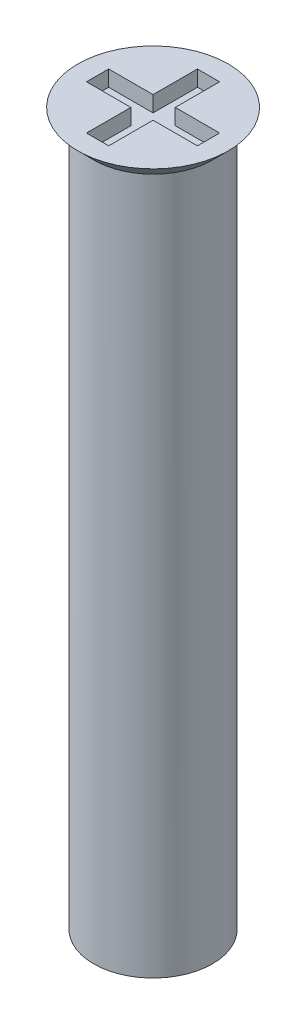
ISO-10303-21;
HEADER;
FILE_DESCRIPTION(('STEP AP214'),'2;1');
FILE_NAME('part.step','',(''),(''),'','','');
FILE_SCHEMA(('AUTOMOTIVE_DESIGN { 1 0 10303 214 1 1 1 1 }'));
ENDSEC;
DATA;
#1=APPLICATION_CONTEXT('core data for automotive mechanical design processes');
#2=APPLICATION_PROTOCOL_DEFINITION('international standard','automotive_design',2000,#1);
#3=PRODUCT_CONTEXT('',#1,'mechanical');
#4=PRODUCT('Part','Part','',(#3));
#5=PRODUCT_RELATED_PRODUCT_CATEGORY('part','',(#4));
#6=PRODUCT_DEFINITION_FORMATION('','',#4);
#7=PRODUCT_DEFINITION_CONTEXT('part definition',#1,'design');
#8=PRODUCT_DEFINITION('design','',#6,#7);
#9=PRODUCT_DEFINITION_SHAPE('','',#8);
#10=(LENGTH_UNIT() NAMED_UNIT(*) SI_UNIT(.MILLI.,.METRE.));
#11=(NAMED_UNIT(*) PLANE_ANGLE_UNIT() SI_UNIT($,.RADIAN.));
#12=(NAMED_UNIT(*) SI_UNIT($,.STERADIAN.) SOLID_ANGLE_UNIT());
#13=UNCERTAINTY_MEASURE_WITH_UNIT(LENGTH_MEASURE(1.E-05),#10,'distance_accuracy_value','');
#14=(GEOMETRIC_REPRESENTATION_CONTEXT(3) GLOBAL_UNCERTAINTY_ASSIGNED_CONTEXT((#13)) GLOBAL_UNIT_ASSIGNED_CONTEXT((#10,
#11,#12)) REPRESENTATION_CONTEXT('',''));
#15=CARTESIAN_POINT('',(0.,0.,0.));
#16=DIRECTION('',(0.,0.,1.));
#17=DIRECTION('',(1.,0.,0.));
#18=AXIS2_PLACEMENT_3D('',#15,#16,#17);
#19=CARTESIAN_POINT('',(0.,0.,0.));
#20=DIRECTION('',(0.,1.,0.));
#21=DIRECTION('',(0.,0.,1.));
#22=AXIS2_PLACEMENT_3D('',#19,#20,#21);
#23=CONICAL_SURFACE('',#22,0.,1.17196166734255);
#24=CARTESIAN_POINT('',(0.,0.31606518346736,0.));
#25=DIRECTION('',(0.,-1.,0.));
#26=DIRECTION('',(0.,0.,-1.));
#27=AXIS2_PLACEMENT_3D('',#24,#25,#26);
#28=CIRCLE('',#27,0.750000000000001);
#29=CARTESIAN_POINT('',(0.,0.31606518346736,-0.750000000000001));
#30=VERTEX_POINT('',#29);
#31=EDGE_CURVE('E207',#30,#30,#28,.T.);
#32=ORIENTED_EDGE('',*,*,#31,.T.);
#33=EDGE_LOOP('',(#32));
#34=FACE_BOUND('',#33,.T.);
#35=CARTESIAN_POINT('',(0.,0.,0.));
#36=VERTEX_POINT('',#35);
#37=VERTEX_LOOP('',#36);
#38=FACE_BOUND('',#37,.T.);
#39=ADVANCED_FACE('F36',(#34,#38),#23,.T.);
#40=CARTESIAN_POINT('',(0.,9.3,0.));
#41=DIRECTION('',(0.,1.,0.));
#42=DIRECTION('',(0.,0.,1.));
#43=AXIS2_PLACEMENT_3D('',#40,#41,#42);
#44=PLANE('',#43);
#45=DIRECTION('',(0.,0.,-1.));
#46=VECTOR('',#45,1.);
#47=CARTESIAN_POINT('',(0.7,9.3,0.14));
#48=LINE('',#47,#46);
#49=CARTESIAN_POINT('',(0.7,9.3,0.14));
#50=VERTEX_POINT('',#49);
#51=CARTESIAN_POINT('',(0.7,9.3,-0.14));
#52=VERTEX_POINT('',#51);
#53=EDGE_CURVE('E50',#50,#52,#48,.T.);
#54=ORIENTED_EDGE('',*,*,#53,.F.);
#55=DIRECTION('',(1.,0.,0.));
#56=VECTOR('',#55,1.);
#57=CARTESIAN_POINT('',(0.14,9.3,0.14));
#58=LINE('',#57,#56);
#59=CARTESIAN_POINT('',(0.14,9.3,0.14));
#60=VERTEX_POINT('',#59);
#61=EDGE_CURVE('E145',#60,#50,#58,.T.);
#62=ORIENTED_EDGE('',*,*,#61,.F.);
#63=DIRECTION('',(0.,0.,-1.));
#64=VECTOR('',#63,1.);
#65=CARTESIAN_POINT('',(0.14,9.3,0.7));
#66=LINE('',#65,#64);
#67=CARTESIAN_POINT('',(0.14,9.3,0.7));
#68=VERTEX_POINT('',#67);
#69=EDGE_CURVE('E148',#68,#60,#66,.T.);
#70=ORIENTED_EDGE('',*,*,#69,.F.);
#71=DIRECTION('',(1.,0.,0.));
#72=VECTOR('',#71,1.);
#73=CARTESIAN_POINT('',(-0.14,9.3,0.7));
#74=LINE('',#73,#72);
#75=CARTESIAN_POINT('',(-0.14,9.3,0.7));
#76=VERTEX_POINT('',#75);
#77=EDGE_CURVE('E200',#76,#68,#74,.T.);
#78=ORIENTED_EDGE('',*,*,#77,.F.);
#79=DIRECTION('',(0.,0.,1.));
#80=VECTOR('',#79,1.);
#81=CARTESIAN_POINT('',(-0.14,9.3,0.7));
#82=LINE('',#81,#80);
#83=CARTESIAN_POINT('',(-0.14,9.3,0.14));
#84=VERTEX_POINT('',#83);
#85=EDGE_CURVE('E197',#84,#76,#82,.T.);
#86=ORIENTED_EDGE('',*,*,#85,.F.);
#87=DIRECTION('',(1.,0.,0.));
#88=VECTOR('',#87,1.);
#89=CARTESIAN_POINT('',(-0.7,9.3,0.14));
#90=LINE('',#89,#88);
#91=CARTESIAN_POINT('',(-0.7,9.3,0.14));
#92=VERTEX_POINT('',#91);
#93=EDGE_CURVE('E194',#92,#84,#90,.T.);
#94=ORIENTED_EDGE('',*,*,#93,.F.);
#95=DIRECTION('',(0.,0.,1.));
#96=VECTOR('',#95,1.);
#97=CARTESIAN_POINT('',(-0.7,9.3,0.14));
#98=LINE('',#97,#96);
#99=CARTESIAN_POINT('',(-0.7,9.3,-0.14));
#100=VERTEX_POINT('',#99);
#101=EDGE_CURVE('E191',#100,#92,#98,.T.);
#102=ORIENTED_EDGE('',*,*,#101,.F.);
#103=DIRECTION('',(-1.,0.,0.));
#104=VECTOR('',#103,1.);
#105=CARTESIAN_POINT('',(-0.7,9.3,-0.14));
#106=LINE('',#105,#104);
#107=CARTESIAN_POINT('',(-0.14,9.3,-0.14));
#108=VERTEX_POINT('',#107);
#109=EDGE_CURVE('E188',#108,#100,#106,.T.);
#110=ORIENTED_EDGE('',*,*,#109,.F.);
#111=DIRECTION('',(0.,0.,1.));
#112=VECTOR('',#111,1.);
#113=CARTESIAN_POINT('',(-0.14,9.3,-0.14));
#114=LINE('',#113,#112);
#115=CARTESIAN_POINT('',(-0.14,9.3,-0.7));
#116=VERTEX_POINT('',#115);
#117=EDGE_CURVE('E185',#116,#108,#114,.T.);
#118=ORIENTED_EDGE('',*,*,#117,.F.);
#119=DIRECTION('',(-1.,0.,0.));
#120=VECTOR('',#119,1.);
#121=CARTESIAN_POINT('',(-0.14,9.3,-0.7));
#122=LINE('',#121,#120);
#123=CARTESIAN_POINT('',(0.14,9.3,-0.7));
#124=VERTEX_POINT('',#123);
#125=EDGE_CURVE('E182',#124,#116,#122,.T.);
#126=ORIENTED_EDGE('',*,*,#125,.F.);
#127=DIRECTION('',(0.,0.,-1.));
#128=VECTOR('',#127,1.);
#129=CARTESIAN_POINT('',(0.14,9.3,-0.14));
#130=LINE('',#129,#128);
#131=CARTESIAN_POINT('',(0.14,9.3,-0.14));
#132=VERTEX_POINT('',#131);
#133=EDGE_CURVE('E179',#132,#124,#130,.T.);
#134=ORIENTED_EDGE('',*,*,#133,.F.);
#135=DIRECTION('',(-1.,0.,0.));
#136=VECTOR('',#135,1.);
#137=CARTESIAN_POINT('',(0.14,9.3,-0.14));
#138=LINE('',#137,#136);
#139=EDGE_CURVE('E177',#52,#132,#138,.T.);
#140=ORIENTED_EDGE('',*,*,#139,.F.);
#141=EDGE_LOOP('',(#54,#62,#70,#78,#86,#94,#102,#110,#118,#126,#134,#140));
#142=FACE_BOUND('',#141,.T.);
#143=CARTESIAN_POINT('',(0.,9.3,0.));
#144=DIRECTION('',(0.,-1.,0.));
#145=DIRECTION('',(0.,0.,-1.));
#146=AXIS2_PLACEMENT_3D('',#143,#144,#145);
#147=CIRCLE('',#146,0.950000000000006);
#148=CARTESIAN_POINT('',(0.,9.3,-0.950000000000006));
#149=VERTEX_POINT('',#148);
#150=EDGE_CURVE('E11',#149,#149,#147,.T.);
#151=ORIENTED_EDGE('',*,*,#150,.F.);
#152=EDGE_LOOP('',(#151));
#153=FACE_BOUND('',#152,.T.);
#154=ADVANCED_FACE('F236',(#142,#153),#44,.T.);
#155=CARTESIAN_POINT('',(0.,9.1,0.));
#156=DIRECTION('',(0.,1.,0.));
#157=DIRECTION('',(0.,0.,1.));
#158=AXIS2_PLACEMENT_3D('',#155,#156,#157);
#159=CONICAL_SURFACE('',#158,0.75,0.785398163397448);
#160=ORIENTED_EDGE('',*,*,#150,.T.);
#161=EDGE_LOOP('',(#160));
#162=FACE_BOUND('',#161,.T.);
#163=CARTESIAN_POINT('',(0.,9.1,0.));
#164=DIRECTION('',(0.,-1.,0.));
#165=DIRECTION('',(0.,0.,-1.));
#166=AXIS2_PLACEMENT_3D('',#163,#164,#165);
#167=CIRCLE('',#166,0.75);
#168=CARTESIAN_POINT('',(0.,9.1,-0.75));
#169=VERTEX_POINT('',#168);
#170=EDGE_CURVE('E43',#169,#169,#167,.T.);
#171=ORIENTED_EDGE('',*,*,#170,.F.);
#172=EDGE_LOOP('',(#171));
#173=FACE_BOUND('',#172,.T.);
#174=ADVANCED_FACE('F234',(#162,#173),#159,.T.);
#175=CARTESIAN_POINT('',(0.,0.,0.));
#176=DIRECTION('',(0.,-1.,0.));
#177=DIRECTION('',(0.,0.,-1.));
#178=AXIS2_PLACEMENT_3D('',#175,#176,#177);
#179=CYLINDRICAL_SURFACE('',#178,0.750000000000001);
#180=ORIENTED_EDGE('',*,*,#170,.T.);
#181=EDGE_LOOP('',(#180));
#182=FACE_BOUND('',#181,.T.);
#183=ORIENTED_EDGE('',*,*,#31,.F.);
#184=EDGE_LOOP('',(#183));
#185=FACE_BOUND('',#184,.T.);
#186=ADVANCED_FACE('F231',(#182,#185),#179,.T.);
#187=CARTESIAN_POINT('',(0.7,9.1,0.14));
#188=DIRECTION('',(1.,0.,0.));
#189=DIRECTION('',(0.,0.,-1.));
#190=AXIS2_PLACEMENT_3D('',#187,#188,#189);
#191=PLANE('',#190);
#192=ORIENTED_EDGE('',*,*,#53,.T.);
#193=DIRECTION('',(0.,1.,0.));
#194=VECTOR('',#193,1.);
#195=CARTESIAN_POINT('',(0.7,9.1,-0.14));
#196=LINE('',#195,#194);
#197=CARTESIAN_POINT('',(0.7,9.1,-0.14));
#198=VERTEX_POINT('',#197);
#199=EDGE_CURVE('E122',#198,#52,#196,.T.);
#200=ORIENTED_EDGE('',*,*,#199,.F.);
#201=DIRECTION('',(0.,0.,-1.));
#202=VECTOR('',#201,1.);
#203=CARTESIAN_POINT('',(0.7,9.1,0.14));
#204=LINE('',#203,#202);
#205=CARTESIAN_POINT('',(0.7,9.1,0.14));
#206=VERTEX_POINT('',#205);
#207=EDGE_CURVE('E126',#206,#198,#204,.T.);
#208=ORIENTED_EDGE('',*,*,#207,.F.);
#209=DIRECTION('',(0.,1.,0.));
#210=VECTOR('',#209,1.);
#211=CARTESIAN_POINT('',(0.7,9.1,0.14));
#212=LINE('',#211,#210);
#213=EDGE_CURVE('E205',#206,#50,#212,.T.);
#214=ORIENTED_EDGE('',*,*,#213,.T.);
#215=EDGE_LOOP('',(#192,#200,#208,#214));
#216=FACE_BOUND('',#215,.T.);
#217=ADVANCED_FACE('F124',(#216),#191,.F.);
#218=CARTESIAN_POINT('',(0.14,9.1,0.14));
#219=DIRECTION('',(0.,0.,1.));
#220=DIRECTION('',(1.,0.,0.));
#221=AXIS2_PLACEMENT_3D('',#218,#219,#220);
#222=PLANE('',#221);
#223=ORIENTED_EDGE('',*,*,#61,.T.);
#224=ORIENTED_EDGE('',*,*,#213,.F.);
#225=DIRECTION('',(1.,0.,0.));
#226=VECTOR('',#225,1.);
#227=CARTESIAN_POINT('',(0.14,9.1,0.14));
#228=LINE('',#227,#226);
#229=CARTESIAN_POINT('',(0.14,9.1,0.14));
#230=VERTEX_POINT('',#229);
#231=EDGE_CURVE('E132',#230,#206,#228,.T.);
#232=ORIENTED_EDGE('',*,*,#231,.F.);
#233=DIRECTION('',(0.,1.,0.));
#234=VECTOR('',#233,1.);
#235=CARTESIAN_POINT('',(0.14,9.1,0.14));
#236=LINE('',#235,#234);
#237=EDGE_CURVE('E208',#230,#60,#236,.T.);
#238=ORIENTED_EDGE('',*,*,#237,.T.);
#239=EDGE_LOOP('',(#223,#224,#232,#238));
#240=FACE_BOUND('',#239,.T.);
#241=ADVANCED_FACE('F267',(#240),#222,.F.);
#242=CARTESIAN_POINT('',(0.14,9.1,0.7));
#243=DIRECTION('',(1.,0.,0.));
#244=DIRECTION('',(0.,0.,-1.));
#245=AXIS2_PLACEMENT_3D('',#242,#243,#244);
#246=PLANE('',#245);
#247=ORIENTED_EDGE('',*,*,#69,.T.);
#248=ORIENTED_EDGE('',*,*,#237,.F.);
#249=DIRECTION('',(0.,0.,-1.));
#250=VECTOR('',#249,1.);
#251=CARTESIAN_POINT('',(0.14,9.1,0.7));
#252=LINE('',#251,#250);
#253=CARTESIAN_POINT('',(0.14,9.1,0.7));
#254=VERTEX_POINT('',#253);
#255=EDGE_CURVE('E173',#254,#230,#252,.T.);
#256=ORIENTED_EDGE('',*,*,#255,.F.);
#257=DIRECTION('',(0.,1.,0.));
#258=VECTOR('',#257,1.);
#259=CARTESIAN_POINT('',(0.14,9.1,0.7));
#260=LINE('',#259,#258);
#261=EDGE_CURVE('E210',#254,#68,#260,.T.);
#262=ORIENTED_EDGE('',*,*,#261,.T.);
#263=EDGE_LOOP('',(#247,#248,#256,#262));
#264=FACE_BOUND('',#263,.T.);
#265=ADVANCED_FACE('F276',(#264),#246,.F.);
#266=CARTESIAN_POINT('',(-0.14,9.1,0.7));
#267=DIRECTION('',(0.,0.,1.));
#268=DIRECTION('',(1.,0.,0.));
#269=AXIS2_PLACEMENT_3D('',#266,#267,#268);
#270=PLANE('',#269);
#271=ORIENTED_EDGE('',*,*,#77,.T.);
#272=ORIENTED_EDGE('',*,*,#261,.F.);
#273=DIRECTION('',(1.,0.,0.));
#274=VECTOR('',#273,1.);
#275=CARTESIAN_POINT('',(-0.14,9.1,0.7));
#276=LINE('',#275,#274);
#277=CARTESIAN_POINT('',(-0.14,9.1,0.7));
#278=VERTEX_POINT('',#277);
#279=EDGE_CURVE('E170',#278,#254,#276,.T.);
#280=ORIENTED_EDGE('',*,*,#279,.F.);
#281=DIRECTION('',(0.,1.,0.));
#282=VECTOR('',#281,1.);
#283=CARTESIAN_POINT('',(-0.14,9.1,0.7));
#284=LINE('',#283,#282);
#285=EDGE_CURVE('E212',#278,#76,#284,.T.);
#286=ORIENTED_EDGE('',*,*,#285,.T.);
#287=EDGE_LOOP('',(#271,#272,#280,#286));
#288=FACE_BOUND('',#287,.T.);
#289=ADVANCED_FACE('F286',(#288),#270,.F.);
#290=CARTESIAN_POINT('',(-0.14,9.1,0.7));
#291=DIRECTION('',(-1.,0.,0.));
#292=DIRECTION('',(0.,0.,1.));
#293=AXIS2_PLACEMENT_3D('',#290,#291,#292);
#294=PLANE('',#293);
#295=ORIENTED_EDGE('',*,*,#85,.T.);
#296=ORIENTED_EDGE('',*,*,#285,.F.);
#297=DIRECTION('',(0.,0.,1.));
#298=VECTOR('',#297,1.);
#299=CARTESIAN_POINT('',(-0.14,9.1,0.7));
#300=LINE('',#299,#298);
#301=CARTESIAN_POINT('',(-0.14,9.1,0.14));
#302=VERTEX_POINT('',#301);
#303=EDGE_CURVE('E167',#302,#278,#300,.T.);
#304=ORIENTED_EDGE('',*,*,#303,.F.);
#305=DIRECTION('',(0.,1.,0.));
#306=VECTOR('',#305,1.);
#307=CARTESIAN_POINT('',(-0.14,9.1,0.14));
#308=LINE('',#307,#306);
#309=EDGE_CURVE('E214',#302,#84,#308,.T.);
#310=ORIENTED_EDGE('',*,*,#309,.T.);
#311=EDGE_LOOP('',(#295,#296,#304,#310));
#312=FACE_BOUND('',#311,.T.);
#313=ADVANCED_FACE('F296',(#312),#294,.F.);
#314=CARTESIAN_POINT('',(-0.7,9.1,0.14));
#315=DIRECTION('',(0.,0.,1.));
#316=DIRECTION('',(1.,0.,0.));
#317=AXIS2_PLACEMENT_3D('',#314,#315,#316);
#318=PLANE('',#317);
#319=ORIENTED_EDGE('',*,*,#93,.T.);
#320=ORIENTED_EDGE('',*,*,#309,.F.);
#321=DIRECTION('',(1.,0.,0.));
#322=VECTOR('',#321,1.);
#323=CARTESIAN_POINT('',(-0.7,9.1,0.14));
#324=LINE('',#323,#322);
#325=CARTESIAN_POINT('',(-0.7,9.1,0.14));
#326=VERTEX_POINT('',#325);
#327=EDGE_CURVE('E164',#326,#302,#324,.T.);
#328=ORIENTED_EDGE('',*,*,#327,.F.);
#329=DIRECTION('',(0.,1.,0.));
#330=VECTOR('',#329,1.);
#331=CARTESIAN_POINT('',(-0.7,9.1,0.14));
#332=LINE('',#331,#330);
#333=EDGE_CURVE('E216',#326,#92,#332,.T.);
#334=ORIENTED_EDGE('',*,*,#333,.T.);
#335=EDGE_LOOP('',(#319,#320,#328,#334));
#336=FACE_BOUND('',#335,.T.);
#337=ADVANCED_FACE('F306',(#336),#318,.F.);
#338=CARTESIAN_POINT('',(-0.7,9.1,0.14));
#339=DIRECTION('',(-1.,0.,0.));
#340=DIRECTION('',(0.,0.,1.));
#341=AXIS2_PLACEMENT_3D('',#338,#339,#340);
#342=PLANE('',#341);
#343=ORIENTED_EDGE('',*,*,#101,.T.);
#344=ORIENTED_EDGE('',*,*,#333,.F.);
#345=DIRECTION('',(0.,0.,1.));
#346=VECTOR('',#345,1.);
#347=CARTESIAN_POINT('',(-0.7,9.1,0.14));
#348=LINE('',#347,#346);
#349=CARTESIAN_POINT('',(-0.7,9.1,-0.14));
#350=VERTEX_POINT('',#349);
#351=EDGE_CURVE('E161',#350,#326,#348,.T.);
#352=ORIENTED_EDGE('',*,*,#351,.F.);
#353=DIRECTION('',(0.,1.,0.));
#354=VECTOR('',#353,1.);
#355=CARTESIAN_POINT('',(-0.7,9.1,-0.14));
#356=LINE('',#355,#354);
#357=EDGE_CURVE('E218',#350,#100,#356,.T.);
#358=ORIENTED_EDGE('',*,*,#357,.T.);
#359=EDGE_LOOP('',(#343,#344,#352,#358));
#360=FACE_BOUND('',#359,.T.);
#361=ADVANCED_FACE('F316',(#360),#342,.F.);
#362=CARTESIAN_POINT('',(-0.7,9.1,-0.14));
#363=DIRECTION('',(0.,0.,-1.));
#364=DIRECTION('',(-1.,0.,0.));
#365=AXIS2_PLACEMENT_3D('',#362,#363,#364);
#366=PLANE('',#365);
#367=ORIENTED_EDGE('',*,*,#109,.T.);
#368=ORIENTED_EDGE('',*,*,#357,.F.);
#369=DIRECTION('',(-1.,0.,0.));
#370=VECTOR('',#369,1.);
#371=CARTESIAN_POINT('',(-0.7,9.1,-0.14));
#372=LINE('',#371,#370);
#373=CARTESIAN_POINT('',(-0.14,9.1,-0.14));
#374=VERTEX_POINT('',#373);
#375=EDGE_CURVE('E158',#374,#350,#372,.T.);
#376=ORIENTED_EDGE('',*,*,#375,.F.);
#377=DIRECTION('',(0.,1.,0.));
#378=VECTOR('',#377,1.);
#379=CARTESIAN_POINT('',(-0.14,9.1,-0.14));
#380=LINE('',#379,#378);
#381=EDGE_CURVE('E220',#374,#108,#380,.T.);
#382=ORIENTED_EDGE('',*,*,#381,.T.);
#383=EDGE_LOOP('',(#367,#368,#376,#382));
#384=FACE_BOUND('',#383,.T.);
#385=ADVANCED_FACE('F326',(#384),#366,.F.);
#386=CARTESIAN_POINT('',(-0.14,9.1,-0.14));
#387=DIRECTION('',(-1.,0.,0.));
#388=DIRECTION('',(0.,0.,1.));
#389=AXIS2_PLACEMENT_3D('',#386,#387,#388);
#390=PLANE('',#389);
#391=ORIENTED_EDGE('',*,*,#117,.T.);
#392=ORIENTED_EDGE('',*,*,#381,.F.);
#393=DIRECTION('',(0.,0.,1.));
#394=VECTOR('',#393,1.);
#395=CARTESIAN_POINT('',(-0.14,9.1,-0.14));
#396=LINE('',#395,#394);
#397=CARTESIAN_POINT('',(-0.14,9.1,-0.7));
#398=VERTEX_POINT('',#397);
#399=EDGE_CURVE('E155',#398,#374,#396,.T.);
#400=ORIENTED_EDGE('',*,*,#399,.F.);
#401=DIRECTION('',(0.,1.,0.));
#402=VECTOR('',#401,1.);
#403=CARTESIAN_POINT('',(-0.14,9.1,-0.7));
#404=LINE('',#403,#402);
#405=EDGE_CURVE('E222',#398,#116,#404,.T.);
#406=ORIENTED_EDGE('',*,*,#405,.T.);
#407=EDGE_LOOP('',(#391,#392,#400,#406));
#408=FACE_BOUND('',#407,.T.);
#409=ADVANCED_FACE('F336',(#408),#390,.F.);
#410=CARTESIAN_POINT('',(-0.14,9.1,-0.7));
#411=DIRECTION('',(0.,0.,-1.));
#412=DIRECTION('',(-1.,0.,0.));
#413=AXIS2_PLACEMENT_3D('',#410,#411,#412);
#414=PLANE('',#413);
#415=ORIENTED_EDGE('',*,*,#125,.T.);
#416=ORIENTED_EDGE('',*,*,#405,.F.);
#417=DIRECTION('',(-1.,0.,0.));
#418=VECTOR('',#417,1.);
#419=CARTESIAN_POINT('',(-0.14,9.1,-0.7));
#420=LINE('',#419,#418);
#421=CARTESIAN_POINT('',(0.14,9.1,-0.7));
#422=VERTEX_POINT('',#421);
#423=EDGE_CURVE('E152',#422,#398,#420,.T.);
#424=ORIENTED_EDGE('',*,*,#423,.F.);
#425=DIRECTION('',(0.,1.,0.));
#426=VECTOR('',#425,1.);
#427=CARTESIAN_POINT('',(0.14,9.1,-0.7));
#428=LINE('',#427,#426);
#429=EDGE_CURVE('E224',#422,#124,#428,.T.);
#430=ORIENTED_EDGE('',*,*,#429,.T.);
#431=EDGE_LOOP('',(#415,#416,#424,#430));
#432=FACE_BOUND('',#431,.T.);
#433=ADVANCED_FACE('F346',(#432),#414,.F.);
#434=CARTESIAN_POINT('',(0.14,9.1,-0.14));
#435=DIRECTION('',(1.,0.,0.));
#436=DIRECTION('',(0.,0.,-1.));
#437=AXIS2_PLACEMENT_3D('',#434,#435,#436);
#438=PLANE('',#437);
#439=ORIENTED_EDGE('',*,*,#133,.T.);
#440=ORIENTED_EDGE('',*,*,#429,.F.);
#441=DIRECTION('',(0.,0.,-1.));
#442=VECTOR('',#441,1.);
#443=CARTESIAN_POINT('',(0.14,9.1,-0.14));
#444=LINE('',#443,#442);
#445=CARTESIAN_POINT('',(0.14,9.1,-0.14));
#446=VERTEX_POINT('',#445);
#447=EDGE_CURVE('E140',#446,#422,#444,.T.);
#448=ORIENTED_EDGE('',*,*,#447,.F.);
#449=DIRECTION('',(0.,1.,0.));
#450=VECTOR('',#449,1.);
#451=CARTESIAN_POINT('',(0.14,9.1,-0.14));
#452=LINE('',#451,#450);
#453=EDGE_CURVE('E131',#446,#132,#452,.T.);
#454=ORIENTED_EDGE('',*,*,#453,.T.);
#455=EDGE_LOOP('',(#439,#440,#448,#454));
#456=FACE_BOUND('',#455,.T.);
#457=ADVANCED_FACE('F356',(#456),#438,.F.);
#458=CARTESIAN_POINT('',(0.14,9.1,-0.14));
#459=DIRECTION('',(0.,0.,-1.));
#460=DIRECTION('',(-1.,0.,0.));
#461=AXIS2_PLACEMENT_3D('',#458,#459,#460);
#462=PLANE('',#461);
#463=ORIENTED_EDGE('',*,*,#139,.T.);
#464=ORIENTED_EDGE('',*,*,#453,.F.);
#465=DIRECTION('',(-1.,0.,0.));
#466=VECTOR('',#465,1.);
#467=CARTESIAN_POINT('',(0.14,9.1,-0.14));
#468=LINE('',#467,#466);
#469=EDGE_CURVE('E135',#198,#446,#468,.T.);
#470=ORIENTED_EDGE('',*,*,#469,.F.);
#471=ORIENTED_EDGE('',*,*,#199,.T.);
#472=EDGE_LOOP('',(#463,#464,#470,#471));
#473=FACE_BOUND('',#472,.T.);
#474=ADVANCED_FACE('F136',(#473),#462,.F.);
#475=CARTESIAN_POINT('',(0.,9.1,0.));
#476=DIRECTION('',(0.,-1.,0.));
#477=DIRECTION('',(0.,0.,-1.));
#478=AXIS2_PLACEMENT_3D('',#475,#476,#477);
#479=PLANE('',#478);
#480=ORIENTED_EDGE('',*,*,#207,.T.);
#481=ORIENTED_EDGE('',*,*,#469,.T.);
#482=ORIENTED_EDGE('',*,*,#447,.T.);
#483=ORIENTED_EDGE('',*,*,#423,.T.);
#484=ORIENTED_EDGE('',*,*,#399,.T.);
#485=ORIENTED_EDGE('',*,*,#375,.T.);
#486=ORIENTED_EDGE('',*,*,#351,.T.);
#487=ORIENTED_EDGE('',*,*,#327,.T.);
#488=ORIENTED_EDGE('',*,*,#303,.T.);
#489=ORIENTED_EDGE('',*,*,#279,.T.);
#490=ORIENTED_EDGE('',*,*,#255,.T.);
#491=ORIENTED_EDGE('',*,*,#231,.T.);
#492=EDGE_LOOP('',(#480,#481,#482,#483,#484,#485,#486,#487,#488,#489,#490,#491));
#493=FACE_BOUND('',#492,.T.);
#494=ADVANCED_FACE('F142',(#493),#479,.F.);
#495=CLOSED_SHELL('',(#39,#154,#174,#186,#217,#241,#265,#289,#313,#337,#361,#385,#409,#433,#457,
#474,#494));
#496=MANIFOLD_SOLID_BREP('B2',#495);
#497=ADVANCED_BREP_SHAPE_REPRESENTATION('',(#18,#496),#14);
#498=SHAPE_DEFINITION_REPRESENTATION(#9,#497);
ENDSEC;
END-ISO-10303-21;
